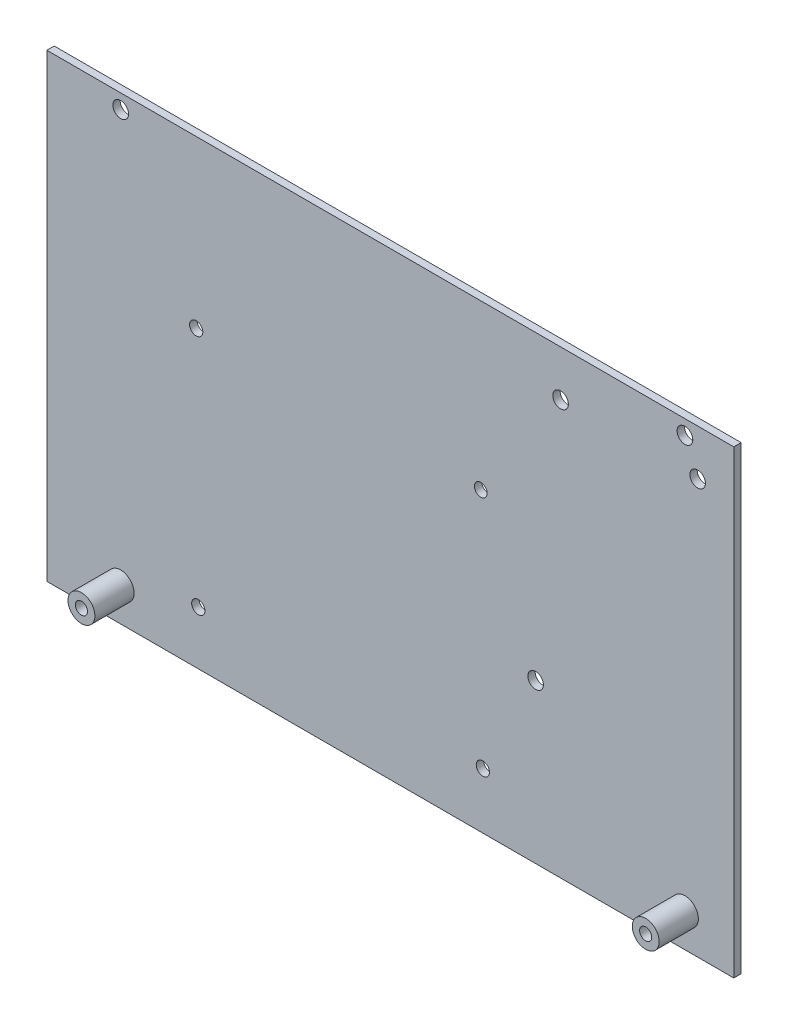
ISO-10303-21;
HEADER;
FILE_DESCRIPTION(('STEP AP214'),'2;1');
FILE_NAME('part.step','',(''),(''),'','','');
FILE_SCHEMA(('AUTOMOTIVE_DESIGN { 1 0 10303 214 1 1 1 1 }'));
ENDSEC;
DATA;
#1=APPLICATION_CONTEXT('core data for automotive mechanical design processes');
#2=APPLICATION_PROTOCOL_DEFINITION('international standard','automotive_design',2000,#1);
#3=PRODUCT_CONTEXT('',#1,'mechanical');
#4=PRODUCT('Part','Part','',(#3));
#5=PRODUCT_RELATED_PRODUCT_CATEGORY('part','',(#4));
#6=PRODUCT_DEFINITION_FORMATION('','',#4);
#7=PRODUCT_DEFINITION_CONTEXT('part definition',#1,'design');
#8=PRODUCT_DEFINITION('design','',#6,#7);
#9=PRODUCT_DEFINITION_SHAPE('','',#8);
#10=(LENGTH_UNIT() NAMED_UNIT(*) SI_UNIT(.MILLI.,.METRE.));
#11=(NAMED_UNIT(*) PLANE_ANGLE_UNIT() SI_UNIT($,.RADIAN.));
#12=(NAMED_UNIT(*) SI_UNIT($,.STERADIAN.) SOLID_ANGLE_UNIT());
#13=UNCERTAINTY_MEASURE_WITH_UNIT(LENGTH_MEASURE(1.E-05),#10,'distance_accuracy_value','');
#14=(GEOMETRIC_REPRESENTATION_CONTEXT(3) GLOBAL_UNCERTAINTY_ASSIGNED_CONTEXT((#13)) GLOBAL_UNIT_ASSIGNED_CONTEXT((#10,
#11,#12)) REPRESENTATION_CONTEXT('',''));
#15=CARTESIAN_POINT('',(0.,0.,0.));
#16=DIRECTION('',(0.,0.,1.));
#17=DIRECTION('',(1.,0.,0.));
#18=AXIS2_PLACEMENT_3D('',#15,#16,#17);
#19=CARTESIAN_POINT('',(32.,242.972657995361,1.5));
#20=DIRECTION('',(1.,0.,0.));
#21=DIRECTION('',(0.,0.,-1.));
#22=AXIS2_PLACEMENT_3D('',#19,#20,#21);
#23=PLANE('',#22);
#24=DIRECTION('',(0.,-1.,0.));
#25=VECTOR('',#24,1.);
#26=CARTESIAN_POINT('',(32.,242.972657995361,0.));
#27=LINE('',#26,#25);
#28=CARTESIAN_POINT('',(32.,242.972657995361,0.));
#29=VERTEX_POINT('',#28);
#30=CARTESIAN_POINT('',(32.,149.218897741784,0.));
#31=VERTEX_POINT('',#30);
#32=EDGE_CURVE('E106',#29,#31,#27,.T.);
#33=ORIENTED_EDGE('',*,*,#32,.T.);
#34=DIRECTION('',(0.,0.,-1.));
#35=VECTOR('',#34,1.);
#36=CARTESIAN_POINT('',(32.,149.218897741784,1.5));
#37=LINE('',#36,#35);
#38=CARTESIAN_POINT('',(32.,149.218897741784,1.5));
#39=VERTEX_POINT('',#38);
#40=EDGE_CURVE('E97',#39,#31,#37,.T.);
#41=ORIENTED_EDGE('',*,*,#40,.F.);
#42=DIRECTION('',(0.,-1.,0.));
#43=VECTOR('',#42,1.);
#44=CARTESIAN_POINT('',(32.,242.972657995361,1.5));
#45=LINE('',#44,#43);
#46=CARTESIAN_POINT('',(32.,242.972657995361,1.5));
#47=VERTEX_POINT('',#46);
#48=EDGE_CURVE('E91',#47,#39,#45,.T.);
#49=ORIENTED_EDGE('',*,*,#48,.F.);
#50=DIRECTION('',(0.,0.,-1.));
#51=VECTOR('',#50,1.);
#52=CARTESIAN_POINT('',(32.,242.972657995361,1.5));
#53=LINE('',#52,#51);
#54=EDGE_CURVE('E102',#47,#29,#53,.T.);
#55=ORIENTED_EDGE('',*,*,#54,.T.);
#56=EDGE_LOOP('',(#33,#41,#49,#55));
#57=FACE_BOUND('',#56,.T.);
#58=ADVANCED_FACE('F39',(#57),#23,.F.);
#59=CARTESIAN_POINT('',(32.,149.218897741784,1.5));
#60=DIRECTION('',(0.,1.,0.));
#61=DIRECTION('',(-1.,0.,0.));
#62=AXIS2_PLACEMENT_3D('',#59,#60,#61);
#63=PLANE('',#62);
#64=DIRECTION('',(1.,0.,0.));
#65=VECTOR('',#64,1.);
#66=CARTESIAN_POINT('',(32.,149.218897741784,0.));
#67=LINE('',#66,#65);
#68=CARTESIAN_POINT('',(172.,149.218897741784,0.));
#69=VERTEX_POINT('',#68);
#70=EDGE_CURVE('E96',#31,#69,#67,.T.);
#71=ORIENTED_EDGE('',*,*,#70,.T.);
#72=DIRECTION('',(0.,0.,-1.));
#73=VECTOR('',#72,1.);
#74=CARTESIAN_POINT('',(172.,149.218897741784,1.5));
#75=LINE('',#74,#73);
#76=CARTESIAN_POINT('',(172.,149.218897741784,1.5));
#77=VERTEX_POINT('',#76);
#78=EDGE_CURVE('E94',#77,#69,#75,.T.);
#79=ORIENTED_EDGE('',*,*,#78,.F.);
#80=DIRECTION('',(1.,0.,0.));
#81=VECTOR('',#80,1.);
#82=CARTESIAN_POINT('',(32.,149.218897741784,1.5));
#83=LINE('',#82,#81);
#84=EDGE_CURVE('E86',#39,#77,#83,.T.);
#85=ORIENTED_EDGE('',*,*,#84,.F.);
#86=ORIENTED_EDGE('',*,*,#40,.T.);
#87=EDGE_LOOP('',(#71,#79,#85,#86));
#88=FACE_BOUND('',#87,.T.);
#89=ADVANCED_FACE('F95',(#88),#63,.F.);
#90=CARTESIAN_POINT('',(172.,242.972657995361,1.5));
#91=DIRECTION('',(-1.,0.,0.));
#92=DIRECTION('',(0.,-1.,0.));
#93=AXIS2_PLACEMENT_3D('',#90,#91,#92);
#94=PLANE('',#93);
#95=DIRECTION('',(0.,1.,0.));
#96=VECTOR('',#95,1.);
#97=CARTESIAN_POINT('',(172.,242.972657995361,0.));
#98=LINE('',#97,#96);
#99=CARTESIAN_POINT('',(172.,242.972657995361,0.));
#100=VERTEX_POINT('',#99);
#101=EDGE_CURVE('E72',#69,#100,#98,.T.);
#102=ORIENTED_EDGE('',*,*,#101,.T.);
#103=DIRECTION('',(0.,0.,-1.));
#104=VECTOR('',#103,1.);
#105=CARTESIAN_POINT('',(172.,242.972657995361,1.5));
#106=LINE('',#105,#104);
#107=CARTESIAN_POINT('',(172.,242.972657995361,1.5));
#108=VERTEX_POINT('',#107);
#109=EDGE_CURVE('E98',#108,#100,#106,.T.);
#110=ORIENTED_EDGE('',*,*,#109,.F.);
#111=DIRECTION('',(0.,1.,0.));
#112=VECTOR('',#111,1.);
#113=CARTESIAN_POINT('',(172.,242.972657995361,1.5));
#114=LINE('',#113,#112);
#115=EDGE_CURVE('E89',#77,#108,#114,.T.);
#116=ORIENTED_EDGE('',*,*,#115,.F.);
#117=ORIENTED_EDGE('',*,*,#78,.T.);
#118=EDGE_LOOP('',(#102,#110,#116,#117));
#119=FACE_BOUND('',#118,.T.);
#120=ADVANCED_FACE('F100',(#119),#94,.F.);
#121=CARTESIAN_POINT('',(32.,242.972657995361,1.5));
#122=DIRECTION('',(0.,-1.,0.));
#123=DIRECTION('',(0.,0.,-1.));
#124=AXIS2_PLACEMENT_3D('',#121,#122,#123);
#125=PLANE('',#124);
#126=DIRECTION('',(-1.,0.,0.));
#127=VECTOR('',#126,1.);
#128=CARTESIAN_POINT('',(32.,242.972657995361,0.));
#129=LINE('',#128,#127);
#130=EDGE_CURVE('E78',#100,#29,#129,.T.);
#131=ORIENTED_EDGE('',*,*,#130,.T.);
#132=ORIENTED_EDGE('',*,*,#54,.F.);
#133=DIRECTION('',(-1.,0.,0.));
#134=VECTOR('',#133,1.);
#135=CARTESIAN_POINT('',(32.,242.972657995361,1.5));
#136=LINE('',#135,#134);
#137=EDGE_CURVE('E55',#108,#47,#136,.T.);
#138=ORIENTED_EDGE('',*,*,#137,.F.);
#139=ORIENTED_EDGE('',*,*,#109,.T.);
#140=EDGE_LOOP('',(#131,#132,#138,#139));
#141=FACE_BOUND('',#140,.T.);
#142=ADVANCED_FACE('F139',(#141),#125,.F.);
#143=CARTESIAN_POINT('',(0.,0.,1.5));
#144=DIRECTION('',(0.,0.,1.));
#145=DIRECTION('',(1.,0.,0.));
#146=AXIS2_PLACEMENT_3D('',#143,#144,#145);
#147=PLANE('',#146);
#148=CARTESIAN_POINT('',(164.633133957523,233.62187254225,1.5));
#149=DIRECTION('',(0.,0.,1.));
#150=DIRECTION('',(1.,0.,0.));
#151=AXIS2_PLACEMENT_3D('',#148,#149,#150);
#152=CIRCLE('',#151,1.58750000000001);
#153=CARTESIAN_POINT('',(166.220633957523,233.62187254225,1.5));
#154=VERTEX_POINT('',#153);
#155=EDGE_CURVE('E313',#154,#154,#152,.T.);
#156=ORIENTED_EDGE('',*,*,#155,.F.);
#157=EDGE_LOOP('',(#156));
#158=FACE_BOUND('',#157,.T.);
#159=CARTESIAN_POINT('',(136.693133957523,233.62187254225,1.5));
#160=DIRECTION('',(0.,0.,1.));
#161=DIRECTION('',(1.,0.,0.));
#162=AXIS2_PLACEMENT_3D('',#159,#160,#161);
#163=CIRCLE('',#162,1.58749999999999);
#164=CARTESIAN_POINT('',(138.280633957523,233.62187254225,1.5));
#165=VERTEX_POINT('',#164);
#166=EDGE_CURVE('E342',#165,#165,#163,.T.);
#167=ORIENTED_EDGE('',*,*,#166,.F.);
#168=EDGE_LOOP('',(#167));
#169=FACE_BOUND('',#168,.T.);
#170=CARTESIAN_POINT('',(131.613133957523,181.55187254225,1.5));
#171=DIRECTION('',(0.,0.,1.));
#172=DIRECTION('',(1.,0.,0.));
#173=AXIS2_PLACEMENT_3D('',#170,#171,#172);
#174=CIRCLE('',#173,1.58749999999999);
#175=CARTESIAN_POINT('',(133.200633957523,181.55187254225,1.5));
#176=VERTEX_POINT('',#175);
#177=EDGE_CURVE('E339',#176,#176,#174,.T.);
#178=ORIENTED_EDGE('',*,*,#177,.F.);
#179=EDGE_LOOP('',(#178));
#180=FACE_BOUND('',#179,.T.);
#181=CARTESIAN_POINT('',(120.859426948787,160.619082086514,1.5));
#182=DIRECTION('',(0.,0.,1.));
#183=DIRECTION('',(1.,0.,0.));
#184=AXIS2_PLACEMENT_3D('',#181,#182,#183);
#185=CIRCLE('',#184,1.34999999999999);
#186=CARTESIAN_POINT('',(122.209426948787,160.619082086514,1.5));
#187=VERTEX_POINT('',#186);
#188=EDGE_CURVE('E336',#187,#187,#185,.T.);
#189=ORIENTED_EDGE('',*,*,#188,.F.);
#190=EDGE_LOOP('',(#189));
#191=FACE_BOUND('',#190,.T.);
#192=CARTESIAN_POINT('',(62.8616354110651,160.112943027609,1.5));
#193=DIRECTION('',(0.,0.,1.));
#194=DIRECTION('',(1.,0.,0.));
#195=AXIS2_PLACEMENT_3D('',#192,#193,#194);
#196=CIRCLE('',#195,1.35);
#197=CARTESIAN_POINT('',(64.2116354110651,160.112943027609,1.5));
#198=VERTEX_POINT('',#197);
#199=EDGE_CURVE('E333',#198,#198,#196,.T.);
#200=ORIENTED_EDGE('',*,*,#199,.F.);
#201=EDGE_LOOP('',(#200));
#202=FACE_BOUND('',#201,.T.);
#203=CARTESIAN_POINT('',(62.4340351716451,209.111077257753,1.5));
#204=DIRECTION('',(0.,0.,1.));
#205=DIRECTION('',(1.,0.,0.));
#206=AXIS2_PLACEMENT_3D('',#203,#204,#205);
#207=CIRCLE('',#206,1.35);
#208=CARTESIAN_POINT('',(63.7840351716451,209.111077257753,1.5));
#209=VERTEX_POINT('',#208);
#210=EDGE_CURVE('E330',#209,#209,#207,.T.);
#211=ORIENTED_EDGE('',*,*,#210,.F.);
#212=EDGE_LOOP('',(#211));
#213=FACE_BOUND('',#212,.T.);
#214=CARTESIAN_POINT('',(120.431826709367,209.617216316659,1.5));
#215=DIRECTION('',(0.,0.,1.));
#216=DIRECTION('',(1.,0.,0.));
#217=AXIS2_PLACEMENT_3D('',#214,#215,#216);
#218=CIRCLE('',#217,1.30000000000001);
#219=CARTESIAN_POINT('',(121.731826709367,209.617216316659,1.5));
#220=VERTEX_POINT('',#219);
#221=EDGE_CURVE('E326',#220,#220,#218,.T.);
#222=ORIENTED_EDGE('',*,*,#221,.F.);
#223=EDGE_LOOP('',(#222));
#224=FACE_BOUND('',#223,.T.);
#225=CARTESIAN_POINT('',(162.044007719528,156.027868215539,1.5));
#226=DIRECTION('',(0.,0.,1.));
#227=DIRECTION('',(1.,0.,0.));
#228=AXIS2_PLACEMENT_3D('',#225,#226,#227);
#229=CIRCLE('',#228,2.73761194428832);
#230=CARTESIAN_POINT('',(164.781619663816,156.027868215539,1.5));
#231=VERTEX_POINT('',#230);
#232=EDGE_CURVE('E347',#231,#231,#229,.T.);
#233=ORIENTED_EDGE('',*,*,#232,.F.);
#234=EDGE_LOOP('',(#233));
#235=FACE_BOUND('',#234,.T.);
#236=CARTESIAN_POINT('',(47.0440077195275,156.027868215539,1.5));
#237=DIRECTION('',(0.,0.,1.));
#238=DIRECTION('',(1.,0.,0.));
#239=AXIS2_PLACEMENT_3D('',#236,#237,#238);
#240=CIRCLE('',#239,2.73761194428832);
#241=CARTESIAN_POINT('',(49.7816196638158,156.027868215539,1.5));
#242=VERTEX_POINT('',#241);
#243=EDGE_CURVE('E358',#242,#242,#240,.T.);
#244=ORIENTED_EDGE('',*,*,#243,.F.);
#245=EDGE_LOOP('',(#244));
#246=FACE_BOUND('',#245,.T.);
#247=CARTESIAN_POINT('',(47.0440077195275,240.027868215539,1.5));
#248=DIRECTION('',(0.,0.,1.));
#249=DIRECTION('',(1.,0.,0.));
#250=AXIS2_PLACEMENT_3D('',#247,#248,#249);
#251=CIRCLE('',#250,1.6);
#252=CARTESIAN_POINT('',(48.6440077195275,240.027868215539,1.5));
#253=VERTEX_POINT('',#252);
#254=EDGE_CURVE('E367',#253,#253,#251,.T.);
#255=ORIENTED_EDGE('',*,*,#254,.F.);
#256=EDGE_LOOP('',(#255));
#257=FACE_BOUND('',#256,.T.);
#258=CARTESIAN_POINT('',(162.044007719528,240.027868215539,1.5));
#259=DIRECTION('',(0.,0.,1.));
#260=DIRECTION('',(1.,0.,0.));
#261=AXIS2_PLACEMENT_3D('',#258,#259,#260);
#262=CIRCLE('',#261,1.60000000000002);
#263=CARTESIAN_POINT('',(163.644007719528,240.027868215539,1.5));
#264=VERTEX_POINT('',#263);
#265=EDGE_CURVE('E370',#264,#264,#262,.T.);
#266=ORIENTED_EDGE('',*,*,#265,.F.);
#267=EDGE_LOOP('',(#266));
#268=FACE_BOUND('',#267,.T.);
#269=ORIENTED_EDGE('',*,*,#48,.T.);
#270=ORIENTED_EDGE('',*,*,#84,.T.);
#271=ORIENTED_EDGE('',*,*,#115,.T.);
#272=ORIENTED_EDGE('',*,*,#137,.T.);
#273=EDGE_LOOP('',(#269,#270,#271,#272));
#274=FACE_BOUND('',#273,.T.);
#275=ADVANCED_FACE('F87',(#158,#169,#180,#191,#202,#213,#224,#235,#246,#257,#268,#274),#147,.T.);
#276=CARTESIAN_POINT('',(0.,0.,0.));
#277=DIRECTION('',(0.,0.,1.));
#278=DIRECTION('',(1.,0.,0.));
#279=AXIS2_PLACEMENT_3D('',#276,#277,#278);
#280=PLANE('',#279);
#281=CARTESIAN_POINT('',(164.633133957523,233.62187254225,0.));
#282=DIRECTION('',(0.,0.,-1.));
#283=DIRECTION('',(-1.,0.,0.));
#284=AXIS2_PLACEMENT_3D('',#281,#282,#283);
#285=CIRCLE('',#284,1.58750000000001);
#286=CARTESIAN_POINT('',(163.045633957523,233.62187254225,0.));
#287=VERTEX_POINT('',#286);
#288=EDGE_CURVE('E315',#287,#287,#285,.T.);
#289=ORIENTED_EDGE('',*,*,#288,.F.);
#290=EDGE_LOOP('',(#289));
#291=FACE_BOUND('',#290,.T.);
#292=CARTESIAN_POINT('',(136.693133957523,233.62187254225,0.));
#293=DIRECTION('',(0.,0.,-1.));
#294=DIRECTION('',(-1.,0.,0.));
#295=AXIS2_PLACEMENT_3D('',#292,#293,#294);
#296=CIRCLE('',#295,1.58749999999999);
#297=CARTESIAN_POINT('',(135.105633957523,233.62187254225,0.));
#298=VERTEX_POINT('',#297);
#299=EDGE_CURVE('E316',#298,#298,#296,.T.);
#300=ORIENTED_EDGE('',*,*,#299,.F.);
#301=EDGE_LOOP('',(#300));
#302=FACE_BOUND('',#301,.T.);
#303=CARTESIAN_POINT('',(131.613133957523,181.55187254225,0.));
#304=DIRECTION('',(0.,0.,-1.));
#305=DIRECTION('',(-1.,0.,0.));
#306=AXIS2_PLACEMENT_3D('',#303,#304,#305);
#307=CIRCLE('',#306,1.58749999999999);
#308=CARTESIAN_POINT('',(130.025633957523,181.55187254225,0.));
#309=VERTEX_POINT('',#308);
#310=EDGE_CURVE('E319',#309,#309,#307,.T.);
#311=ORIENTED_EDGE('',*,*,#310,.F.);
#312=EDGE_LOOP('',(#311));
#313=FACE_BOUND('',#312,.T.);
#314=CARTESIAN_POINT('',(120.859426948787,160.619082086514,0.));
#315=DIRECTION('',(0.,0.,-1.));
#316=DIRECTION('',(-1.,0.,0.));
#317=AXIS2_PLACEMENT_3D('',#314,#315,#316);
#318=CIRCLE('',#317,1.34999999999999);
#319=CARTESIAN_POINT('',(119.509426948787,160.619082086514,0.));
#320=VERTEX_POINT('',#319);
#321=EDGE_CURVE('E421',#320,#320,#318,.T.);
#322=ORIENTED_EDGE('',*,*,#321,.F.);
#323=EDGE_LOOP('',(#322));
#324=FACE_BOUND('',#323,.T.);
#325=CARTESIAN_POINT('',(62.8616354110651,160.112943027609,0.));
#326=DIRECTION('',(0.,0.,-1.));
#327=DIRECTION('',(-1.,0.,0.));
#328=AXIS2_PLACEMENT_3D('',#325,#326,#327);
#329=CIRCLE('',#328,1.35);
#330=CARTESIAN_POINT('',(61.5116354110651,160.112943027609,0.));
#331=VERTEX_POINT('',#330);
#332=EDGE_CURVE('E418',#331,#331,#329,.T.);
#333=ORIENTED_EDGE('',*,*,#332,.F.);
#334=EDGE_LOOP('',(#333));
#335=FACE_BOUND('',#334,.T.);
#336=CARTESIAN_POINT('',(62.4340351716451,209.111077257753,0.));
#337=DIRECTION('',(0.,0.,-1.));
#338=DIRECTION('',(-1.,0.,0.));
#339=AXIS2_PLACEMENT_3D('',#336,#337,#338);
#340=CIRCLE('',#339,1.35);
#341=CARTESIAN_POINT('',(61.0840351716451,209.111077257753,0.));
#342=VERTEX_POINT('',#341);
#343=EDGE_CURVE('E327',#342,#342,#340,.T.);
#344=ORIENTED_EDGE('',*,*,#343,.F.);
#345=EDGE_LOOP('',(#344));
#346=FACE_BOUND('',#345,.T.);
#347=CARTESIAN_POINT('',(120.431826709367,209.617216316659,0.));
#348=DIRECTION('',(0.,0.,-1.));
#349=DIRECTION('',(-1.,0.,0.));
#350=AXIS2_PLACEMENT_3D('',#347,#348,#349);
#351=CIRCLE('',#350,1.30000000000001);
#352=CARTESIAN_POINT('',(119.131826709367,209.617216316659,0.));
#353=VERTEX_POINT('',#352);
#354=EDGE_CURVE('E323',#353,#353,#351,.T.);
#355=ORIENTED_EDGE('',*,*,#354,.F.);
#356=EDGE_LOOP('',(#355));
#357=FACE_BOUND('',#356,.T.);
#358=CARTESIAN_POINT('',(47.0440077195275,240.027868215539,0.));
#359=DIRECTION('',(0.,0.,1.));
#360=DIRECTION('',(1.,0.,0.));
#361=AXIS2_PLACEMENT_3D('',#358,#359,#360);
#362=CIRCLE('',#361,1.6);
#363=CARTESIAN_POINT('',(48.6440077195275,240.027868215539,0.));
#364=VERTEX_POINT('',#363);
#365=EDGE_CURVE('E109',#364,#364,#362,.T.);
#366=ORIENTED_EDGE('',*,*,#365,.T.);
#367=EDGE_LOOP('',(#366));
#368=FACE_BOUND('',#367,.T.);
#369=CARTESIAN_POINT('',(162.044007719528,240.027868215539,0.));
#370=DIRECTION('',(0.,0.,1.));
#371=DIRECTION('',(1.,0.,0.));
#372=AXIS2_PLACEMENT_3D('',#369,#370,#371);
#373=CIRCLE('',#372,1.60000000000002);
#374=CARTESIAN_POINT('',(163.644007719528,240.027868215539,0.));
#375=VERTEX_POINT('',#374);
#376=EDGE_CURVE('E362',#375,#375,#373,.T.);
#377=ORIENTED_EDGE('',*,*,#376,.T.);
#378=EDGE_LOOP('',(#377));
#379=FACE_BOUND('',#378,.T.);
#380=ORIENTED_EDGE('',*,*,#32,.F.);
#381=ORIENTED_EDGE('',*,*,#130,.F.);
#382=ORIENTED_EDGE('',*,*,#101,.F.);
#383=ORIENTED_EDGE('',*,*,#70,.F.);
#384=EDGE_LOOP('',(#380,#381,#382,#383));
#385=FACE_BOUND('',#384,.T.);
#386=ADVANCED_FACE('F138',(#291,#302,#313,#324,#335,#346,#357,#368,#379,#385),#280,.F.);
#387=CARTESIAN_POINT('',(162.044007719528,240.027868215539,0.));
#388=DIRECTION('',(0.,0.,1.));
#389=DIRECTION('',(1.,0.,0.));
#390=AXIS2_PLACEMENT_3D('',#387,#388,#389);
#391=CYLINDRICAL_SURFACE('',#390,1.60000000000002);
#392=ORIENTED_EDGE('',*,*,#376,.F.);
#393=EDGE_LOOP('',(#392));
#394=FACE_BOUND('',#393,.T.);
#395=ORIENTED_EDGE('',*,*,#265,.T.);
#396=EDGE_LOOP('',(#395));
#397=FACE_BOUND('',#396,.T.);
#398=ADVANCED_FACE('F153',(#394,#397),#391,.F.);
#399=CARTESIAN_POINT('',(47.0440077195275,240.027868215539,0.));
#400=DIRECTION('',(0.,0.,1.));
#401=DIRECTION('',(1.,0.,0.));
#402=AXIS2_PLACEMENT_3D('',#399,#400,#401);
#403=CYLINDRICAL_SURFACE('',#402,1.6);
#404=ORIENTED_EDGE('',*,*,#365,.F.);
#405=EDGE_LOOP('',(#404));
#406=FACE_BOUND('',#405,.T.);
#407=ORIENTED_EDGE('',*,*,#254,.T.);
#408=EDGE_LOOP('',(#407));
#409=FACE_BOUND('',#408,.T.);
#410=ADVANCED_FACE('F159',(#406,#409),#403,.F.);
#411=CARTESIAN_POINT('',(47.0440077195275,156.027868215539,9.5));
#412=DIRECTION('',(0.,0.,1.));
#413=DIRECTION('',(1.,0.,0.));
#414=AXIS2_PLACEMENT_3D('',#411,#412,#413);
#415=PLANE('',#414);
#416=CARTESIAN_POINT('',(47.0440077195275,156.027868215539,9.5));
#417=DIRECTION('',(0.,0.,1.));
#418=DIRECTION('',(1.,0.,0.));
#419=AXIS2_PLACEMENT_3D('',#416,#417,#418);
#420=CIRCLE('',#419,2.73761194428832);
#421=CARTESIAN_POINT('',(49.7816196638158,156.027868215539,9.5));
#422=VERTEX_POINT('',#421);
#423=EDGE_CURVE('E359',#422,#422,#420,.T.);
#424=ORIENTED_EDGE('',*,*,#423,.T.);
#425=EDGE_LOOP('',(#424));
#426=FACE_BOUND('',#425,.T.);
#427=CARTESIAN_POINT('',(47.0440077195275,156.027868215539,9.5));
#428=DIRECTION('',(0.,0.,1.));
#429=DIRECTION('',(1.,0.,0.));
#430=AXIS2_PLACEMENT_3D('',#427,#428,#429);
#431=CIRCLE('',#430,1.23761194428833);
#432=CARTESIAN_POINT('',(48.2816196638158,156.027868215539,9.5));
#433=VERTEX_POINT('',#432);
#434=EDGE_CURVE('E355',#433,#433,#431,.T.);
#435=ORIENTED_EDGE('',*,*,#434,.F.);
#436=EDGE_LOOP('',(#435));
#437=FACE_BOUND('',#436,.T.);
#438=ADVANCED_FACE('F189',(#426,#437),#415,.T.);
#439=CARTESIAN_POINT('',(47.0440077195275,156.027868215539,9.5));
#440=DIRECTION('',(0.,0.,-1.));
#441=DIRECTION('',(-1.,0.,0.));
#442=AXIS2_PLACEMENT_3D('',#439,#440,#441);
#443=CYLINDRICAL_SURFACE('',#442,2.73761194428832);
#444=ORIENTED_EDGE('',*,*,#423,.F.);
#445=EDGE_LOOP('',(#444));
#446=FACE_BOUND('',#445,.T.);
#447=ORIENTED_EDGE('',*,*,#243,.T.);
#448=EDGE_LOOP('',(#447));
#449=FACE_BOUND('',#448,.T.);
#450=ADVANCED_FACE('F132',(#446,#449),#443,.T.);
#451=CARTESIAN_POINT('',(47.0440077195275,156.027868215539,9.5));
#452=DIRECTION('',(0.,0.,-1.));
#453=DIRECTION('',(-1.,0.,0.));
#454=AXIS2_PLACEMENT_3D('',#451,#452,#453);
#455=CYLINDRICAL_SURFACE('',#454,1.23761194428833);
#456=ORIENTED_EDGE('',*,*,#434,.T.);
#457=EDGE_LOOP('',(#456));
#458=FACE_BOUND('',#457,.T.);
#459=CARTESIAN_POINT('',(47.0440077195275,156.027868215539,1.5));
#460=DIRECTION('',(0.,0.,1.));
#461=DIRECTION('',(1.,0.,0.));
#462=AXIS2_PLACEMENT_3D('',#459,#460,#461);
#463=CIRCLE('',#462,1.23761194428833);
#464=CARTESIAN_POINT('',(48.2816196638158,156.027868215539,1.5));
#465=VERTEX_POINT('',#464);
#466=EDGE_CURVE('E47',#465,#465,#463,.F.);
#467=ORIENTED_EDGE('',*,*,#466,.T.);
#468=EDGE_LOOP('',(#467));
#469=FACE_BOUND('',#468,.T.);
#470=ADVANCED_FACE('F118',(#458,#469),#455,.F.);
#471=ORIENTED_EDGE('',*,*,#466,.F.);
#472=EDGE_LOOP('',(#471));
#473=FACE_BOUND('',#472,.T.);
#474=ADVANCED_FACE('F120',(#473),#147,.T.);
#475=CARTESIAN_POINT('',(162.044007719528,156.027868215539,9.5));
#476=DIRECTION('',(0.,0.,1.));
#477=DIRECTION('',(1.,0.,0.));
#478=AXIS2_PLACEMENT_3D('',#475,#476,#477);
#479=PLANE('',#478);
#480=CARTESIAN_POINT('',(162.044007719528,156.027868215539,9.5));
#481=DIRECTION('',(0.,0.,1.));
#482=DIRECTION('',(1.,0.,0.));
#483=AXIS2_PLACEMENT_3D('',#480,#481,#482);
#484=CIRCLE('',#483,2.73761194428832);
#485=CARTESIAN_POINT('',(164.781619663816,156.027868215539,9.5));
#486=VERTEX_POINT('',#485);
#487=EDGE_CURVE('E346',#486,#486,#484,.T.);
#488=ORIENTED_EDGE('',*,*,#487,.T.);
#489=EDGE_LOOP('',(#488));
#490=FACE_BOUND('',#489,.T.);
#491=CARTESIAN_POINT('',(162.044007719528,156.027868215539,9.5));
#492=DIRECTION('',(0.,0.,1.));
#493=DIRECTION('',(1.,0.,0.));
#494=AXIS2_PLACEMENT_3D('',#491,#492,#493);
#495=CIRCLE('',#494,1.23761194428831);
#496=CARTESIAN_POINT('',(163.281619663816,156.027868215539,9.5));
#497=VERTEX_POINT('',#496);
#498=EDGE_CURVE('E350',#497,#497,#495,.T.);
#499=ORIENTED_EDGE('',*,*,#498,.F.);
#500=EDGE_LOOP('',(#499));
#501=FACE_BOUND('',#500,.T.);
#502=ADVANCED_FACE('F122',(#490,#501),#479,.T.);
#503=CARTESIAN_POINT('',(162.044007719528,156.027868215539,9.5));
#504=DIRECTION('',(0.,0.,-1.));
#505=DIRECTION('',(-1.,0.,0.));
#506=AXIS2_PLACEMENT_3D('',#503,#504,#505);
#507=CYLINDRICAL_SURFACE('',#506,2.73761194428832);
#508=ORIENTED_EDGE('',*,*,#487,.F.);
#509=EDGE_LOOP('',(#508));
#510=FACE_BOUND('',#509,.T.);
#511=ORIENTED_EDGE('',*,*,#232,.T.);
#512=EDGE_LOOP('',(#511));
#513=FACE_BOUND('',#512,.T.);
#514=ADVANCED_FACE('F129',(#510,#513),#507,.T.);
#515=CARTESIAN_POINT('',(162.044007719528,156.027868215539,9.5));
#516=DIRECTION('',(0.,0.,-1.));
#517=DIRECTION('',(-1.,0.,0.));
#518=AXIS2_PLACEMENT_3D('',#515,#516,#517);
#519=CYLINDRICAL_SURFACE('',#518,1.23761194428831);
#520=ORIENTED_EDGE('',*,*,#498,.T.);
#521=EDGE_LOOP('',(#520));
#522=FACE_BOUND('',#521,.T.);
#523=CARTESIAN_POINT('',(162.044007719528,156.027868215539,1.5));
#524=DIRECTION('',(0.,0.,1.));
#525=DIRECTION('',(1.,0.,0.));
#526=AXIS2_PLACEMENT_3D('',#523,#524,#525);
#527=CIRCLE('',#526,1.23761194428831);
#528=CARTESIAN_POINT('',(163.281619663816,156.027868215539,1.5));
#529=VERTEX_POINT('',#528);
#530=EDGE_CURVE('E11',#529,#529,#527,.F.);
#531=ORIENTED_EDGE('',*,*,#530,.T.);
#532=EDGE_LOOP('',(#531));
#533=FACE_BOUND('',#532,.T.);
#534=ADVANCED_FACE('F143',(#522,#533),#519,.F.);
#535=ORIENTED_EDGE('',*,*,#530,.F.);
#536=EDGE_LOOP('',(#535));
#537=FACE_BOUND('',#536,.T.);
#538=ADVANCED_FACE('F124',(#537),#147,.T.);
#539=CARTESIAN_POINT('',(120.431826709367,209.617216316659,8.));
#540=DIRECTION('',(0.,0.,-1.));
#541=DIRECTION('',(-1.,0.,0.));
#542=AXIS2_PLACEMENT_3D('',#539,#540,#541);
#543=CYLINDRICAL_SURFACE('',#542,1.30000000000001);
#544=ORIENTED_EDGE('',*,*,#221,.T.);
#545=EDGE_LOOP('',(#544));
#546=FACE_BOUND('',#545,.T.);
#547=ORIENTED_EDGE('',*,*,#354,.T.);
#548=EDGE_LOOP('',(#547));
#549=FACE_BOUND('',#548,.T.);
#550=ADVANCED_FACE('F142',(#546,#549),#543,.F.);
#551=CARTESIAN_POINT('',(62.4340351716451,209.111077257753,8.));
#552=DIRECTION('',(0.,0.,-1.));
#553=DIRECTION('',(-1.,0.,0.));
#554=AXIS2_PLACEMENT_3D('',#551,#552,#553);
#555=CYLINDRICAL_SURFACE('',#554,1.35);
#556=ORIENTED_EDGE('',*,*,#210,.T.);
#557=EDGE_LOOP('',(#556));
#558=FACE_BOUND('',#557,.T.);
#559=ORIENTED_EDGE('',*,*,#343,.T.);
#560=EDGE_LOOP('',(#559));
#561=FACE_BOUND('',#560,.T.);
#562=ADVANCED_FACE('F247',(#558,#561),#555,.F.);
#563=CARTESIAN_POINT('',(62.8616354110651,160.112943027609,8.));
#564=DIRECTION('',(0.,0.,-1.));
#565=DIRECTION('',(-1.,0.,0.));
#566=AXIS2_PLACEMENT_3D('',#563,#564,#565);
#567=CYLINDRICAL_SURFACE('',#566,1.35);
#568=ORIENTED_EDGE('',*,*,#199,.T.);
#569=EDGE_LOOP('',(#568));
#570=FACE_BOUND('',#569,.T.);
#571=ORIENTED_EDGE('',*,*,#332,.T.);
#572=EDGE_LOOP('',(#571));
#573=FACE_BOUND('',#572,.T.);
#574=ADVANCED_FACE('F257',(#570,#573),#567,.F.);
#575=CARTESIAN_POINT('',(120.859426948787,160.619082086514,8.));
#576=DIRECTION('',(0.,0.,-1.));
#577=DIRECTION('',(-1.,0.,0.));
#578=AXIS2_PLACEMENT_3D('',#575,#576,#577);
#579=CYLINDRICAL_SURFACE('',#578,1.34999999999999);
#580=ORIENTED_EDGE('',*,*,#188,.T.);
#581=EDGE_LOOP('',(#580));
#582=FACE_BOUND('',#581,.T.);
#583=ORIENTED_EDGE('',*,*,#321,.T.);
#584=EDGE_LOOP('',(#583));
#585=FACE_BOUND('',#584,.T.);
#586=ADVANCED_FACE('F267',(#582,#585),#579,.F.);
#587=CARTESIAN_POINT('',(131.613133957523,181.55187254225,8.));
#588=DIRECTION('',(0.,0.,-1.));
#589=DIRECTION('',(-1.,0.,0.));
#590=AXIS2_PLACEMENT_3D('',#587,#588,#589);
#591=CYLINDRICAL_SURFACE('',#590,1.58749999999999);
#592=ORIENTED_EDGE('',*,*,#177,.T.);
#593=EDGE_LOOP('',(#592));
#594=FACE_BOUND('',#593,.T.);
#595=ORIENTED_EDGE('',*,*,#310,.T.);
#596=EDGE_LOOP('',(#595));
#597=FACE_BOUND('',#596,.T.);
#598=ADVANCED_FACE('F277',(#594,#597),#591,.F.);
#599=CARTESIAN_POINT('',(136.693133957523,233.62187254225,8.));
#600=DIRECTION('',(0.,0.,-1.));
#601=DIRECTION('',(-1.,0.,0.));
#602=AXIS2_PLACEMENT_3D('',#599,#600,#601);
#603=CYLINDRICAL_SURFACE('',#602,1.58749999999999);
#604=ORIENTED_EDGE('',*,*,#166,.T.);
#605=EDGE_LOOP('',(#604));
#606=FACE_BOUND('',#605,.T.);
#607=ORIENTED_EDGE('',*,*,#299,.T.);
#608=EDGE_LOOP('',(#607));
#609=FACE_BOUND('',#608,.T.);
#610=ADVANCED_FACE('F287',(#606,#609),#603,.F.);
#611=CARTESIAN_POINT('',(164.633133957523,233.62187254225,8.));
#612=DIRECTION('',(0.,0.,-1.));
#613=DIRECTION('',(-1.,0.,0.));
#614=AXIS2_PLACEMENT_3D('',#611,#612,#613);
#615=CYLINDRICAL_SURFACE('',#614,1.58750000000001);
#616=ORIENTED_EDGE('',*,*,#155,.T.);
#617=EDGE_LOOP('',(#616));
#618=FACE_BOUND('',#617,.T.);
#619=ORIENTED_EDGE('',*,*,#288,.T.);
#620=EDGE_LOOP('',(#619));
#621=FACE_BOUND('',#620,.T.);
#622=ADVANCED_FACE('F297',(#618,#621),#615,.F.);
#623=CLOSED_SHELL('',(#58,#89,#120,#142,#275,#386,#398,#410,#438,#450,#470,#474,#502,#514,#534,
#538,#550,#562,#574,#586,#598,#610,#622));
#624=MANIFOLD_SOLID_BREP('B2',#623);
#625=ADVANCED_BREP_SHAPE_REPRESENTATION('',(#18,#624),#14);
#626=SHAPE_DEFINITION_REPRESENTATION(#9,#625);
ENDSEC;
END-ISO-10303-21;
